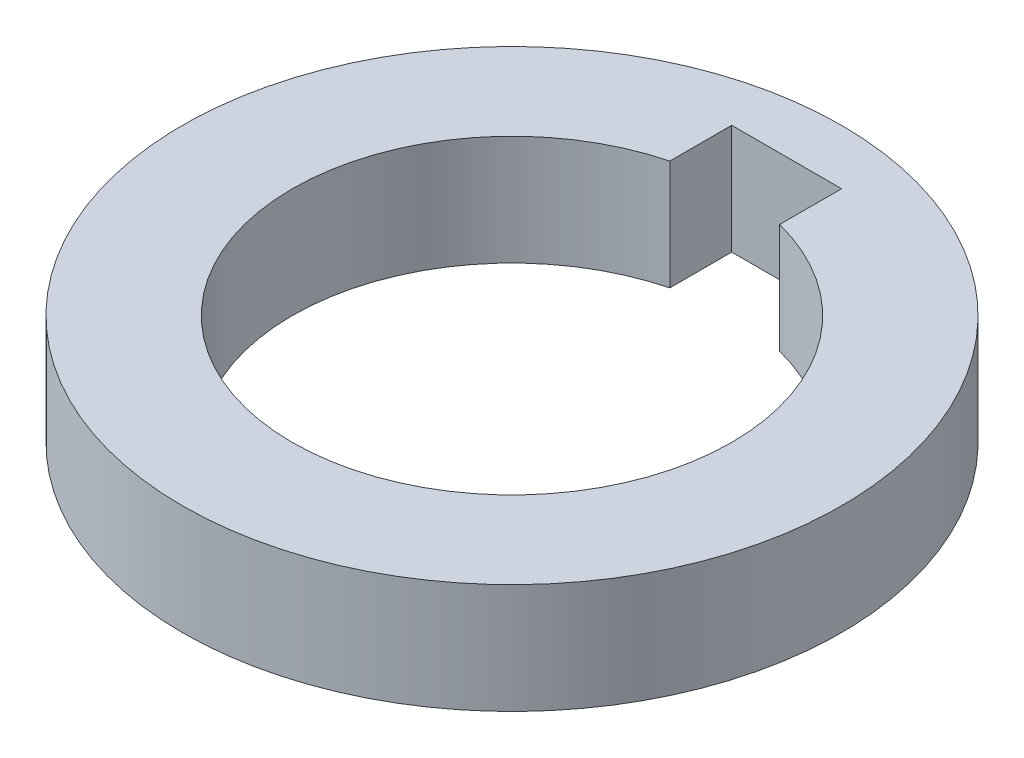
ISO-10303-21;
HEADER;
FILE_DESCRIPTION(('STEP AP214'),'2;1');
FILE_NAME('part.step','',(''),(''),'','','');
FILE_SCHEMA(('AUTOMOTIVE_DESIGN { 1 0 10303 214 1 1 1 1 }'));
ENDSEC;
DATA;
#1=APPLICATION_CONTEXT('core data for automotive mechanical design processes');
#2=APPLICATION_PROTOCOL_DEFINITION('international standard','automotive_design',2000,#1);
#3=PRODUCT_CONTEXT('',#1,'mechanical');
#4=PRODUCT('Part','Part','',(#3));
#5=PRODUCT_RELATED_PRODUCT_CATEGORY('part','',(#4));
#6=PRODUCT_DEFINITION_FORMATION('','',#4);
#7=PRODUCT_DEFINITION_CONTEXT('part definition',#1,'design');
#8=PRODUCT_DEFINITION('design','',#6,#7);
#9=PRODUCT_DEFINITION_SHAPE('','',#8);
#10=(LENGTH_UNIT() NAMED_UNIT(*) SI_UNIT(.MILLI.,.METRE.));
#11=(NAMED_UNIT(*) PLANE_ANGLE_UNIT() SI_UNIT($,.RADIAN.));
#12=(NAMED_UNIT(*) SI_UNIT($,.STERADIAN.) SOLID_ANGLE_UNIT());
#13=UNCERTAINTY_MEASURE_WITH_UNIT(LENGTH_MEASURE(1.E-05),#10,'distance_accuracy_value','');
#14=(GEOMETRIC_REPRESENTATION_CONTEXT(3) GLOBAL_UNCERTAINTY_ASSIGNED_CONTEXT((#13)) GLOBAL_UNIT_ASSIGNED_CONTEXT((#10,
#11,#12)) REPRESENTATION_CONTEXT('',''));
#15=CARTESIAN_POINT('',(0.,0.,0.));
#16=DIRECTION('',(0.,0.,1.));
#17=DIRECTION('',(1.,0.,0.));
#18=AXIS2_PLACEMENT_3D('',#15,#16,#17);
#19=CARTESIAN_POINT('',(0.,3.175,0.));
#20=DIRECTION('',(0.,-1.,0.));
#21=DIRECTION('',(0.,0.,-1.));
#22=AXIS2_PLACEMENT_3D('',#19,#20,#21);
#23=CYLINDRICAL_SURFACE('',#22,6.35);
#24=CARTESIAN_POINT('',(0.,0.,0.));
#25=DIRECTION('',(0.,1.,0.));
#26=DIRECTION('',(0.,0.,1.));
#27=AXIS2_PLACEMENT_3D('',#24,#25,#26);
#28=CIRCLE('',#27,6.35);
#29=CARTESIAN_POINT('',(-1.5875,0.,-6.14836106210427));
#30=VERTEX_POINT('',#29);
#31=CARTESIAN_POINT('',(1.5875,0.,-6.14836106210427));
#32=VERTEX_POINT('',#31);
#33=EDGE_CURVE('E102',#30,#32,#28,.T.);
#34=ORIENTED_EDGE('',*,*,#33,.F.);
#35=DIRECTION('',(0.,-1.,0.));
#36=VECTOR('',#35,1.);
#37=CARTESIAN_POINT('',(-1.5875,3.175,-6.14836106210427));
#38=LINE('',#37,#36);
#39=CARTESIAN_POINT('',(-1.5875,3.175,-6.14836106210427));
#40=VERTEX_POINT('',#39);
#41=EDGE_CURVE('E11',#40,#30,#38,.T.);
#42=ORIENTED_EDGE('',*,*,#41,.F.);
#43=CARTESIAN_POINT('',(0.,3.175,0.));
#44=DIRECTION('',(0.,1.,0.));
#45=DIRECTION('',(0.,0.,1.));
#46=AXIS2_PLACEMENT_3D('',#43,#44,#45);
#47=CIRCLE('',#46,6.35);
#48=CARTESIAN_POINT('',(1.5875,3.175,-6.14836106210427));
#49=VERTEX_POINT('',#48);
#50=EDGE_CURVE('E93',#40,#49,#47,.T.);
#51=ORIENTED_EDGE('',*,*,#50,.T.);
#52=DIRECTION('',(0.,-1.,0.));
#53=VECTOR('',#52,1.);
#54=CARTESIAN_POINT('',(1.5875,3.175,-6.14836106210427));
#55=LINE('',#54,#53);
#56=EDGE_CURVE('E73',#49,#32,#55,.T.);
#57=ORIENTED_EDGE('',*,*,#56,.T.);
#58=EDGE_LOOP('',(#34,#42,#51,#57));
#59=FACE_BOUND('',#58,.T.);
#60=ADVANCED_FACE('F35',(#59),#23,.F.);
#61=CARTESIAN_POINT('',(-1.5875,3.175,0.));
#62=DIRECTION('',(1.,0.,0.));
#63=DIRECTION('',(0.,0.,-1.));
#64=AXIS2_PLACEMENT_3D('',#61,#62,#63);
#65=PLANE('',#64);
#66=DIRECTION('',(0.,0.,1.));
#67=VECTOR('',#66,1.);
#68=CARTESIAN_POINT('',(-1.5875,0.,0.));
#69=LINE('',#68,#67);
#70=CARTESIAN_POINT('',(-1.5875,0.,-7.9375));
#71=VERTEX_POINT('',#70);
#72=EDGE_CURVE('E86',#71,#30,#69,.T.);
#73=ORIENTED_EDGE('',*,*,#72,.F.);
#74=DIRECTION('',(0.,-1.,0.));
#75=VECTOR('',#74,1.);
#76=CARTESIAN_POINT('',(-1.5875,3.175,-7.9375));
#77=LINE('',#76,#75);
#78=CARTESIAN_POINT('',(-1.5875,3.175,-7.9375));
#79=VERTEX_POINT('',#78);
#80=EDGE_CURVE('E43',#79,#71,#77,.T.);
#81=ORIENTED_EDGE('',*,*,#80,.F.);
#82=DIRECTION('',(0.,0.,1.));
#83=VECTOR('',#82,1.);
#84=CARTESIAN_POINT('',(-1.5875,3.175,0.));
#85=LINE('',#84,#83);
#86=EDGE_CURVE('E84',#79,#40,#85,.T.);
#87=ORIENTED_EDGE('',*,*,#86,.T.);
#88=ORIENTED_EDGE('',*,*,#41,.T.);
#89=EDGE_LOOP('',(#73,#81,#87,#88));
#90=FACE_BOUND('',#89,.T.);
#91=ADVANCED_FACE('F82',(#90),#65,.T.);
#92=CARTESIAN_POINT('',(0.,3.175,-7.9375));
#93=DIRECTION('',(0.,0.,-1.));
#94=DIRECTION('',(-1.,0.,0.));
#95=AXIS2_PLACEMENT_3D('',#92,#93,#94);
#96=PLANE('',#95);
#97=DIRECTION('',(1.,0.,0.));
#98=VECTOR('',#97,1.);
#99=CARTESIAN_POINT('',(0.,0.,-7.9375));
#100=LINE('',#99,#98);
#101=CARTESIAN_POINT('',(1.5875,0.,-7.9375));
#102=VERTEX_POINT('',#101);
#103=EDGE_CURVE('E66',#71,#102,#100,.T.);
#104=ORIENTED_EDGE('',*,*,#103,.T.);
#105=DIRECTION('',(0.,-1.,0.));
#106=VECTOR('',#105,1.);
#107=CARTESIAN_POINT('',(1.5875,3.175,-7.9375));
#108=LINE('',#107,#106);
#109=CARTESIAN_POINT('',(1.5875,3.175,-7.9375));
#110=VERTEX_POINT('',#109);
#111=EDGE_CURVE('E87',#110,#102,#108,.T.);
#112=ORIENTED_EDGE('',*,*,#111,.F.);
#113=DIRECTION('',(1.,0.,0.));
#114=VECTOR('',#113,1.);
#115=CARTESIAN_POINT('',(0.,3.175,-7.9375));
#116=LINE('',#115,#114);
#117=EDGE_CURVE('E88',#79,#110,#116,.T.);
#118=ORIENTED_EDGE('',*,*,#117,.F.);
#119=ORIENTED_EDGE('',*,*,#80,.T.);
#120=EDGE_LOOP('',(#104,#112,#118,#119));
#121=FACE_BOUND('',#120,.T.);
#122=ADVANCED_FACE('F89',(#121),#96,.F.);
#123=CARTESIAN_POINT('',(1.5875,3.175,0.));
#124=DIRECTION('',(1.,0.,0.));
#125=DIRECTION('',(0.,0.,-1.));
#126=AXIS2_PLACEMENT_3D('',#123,#124,#125);
#127=PLANE('',#126);
#128=DIRECTION('',(0.,0.,1.));
#129=VECTOR('',#128,1.);
#130=CARTESIAN_POINT('',(1.5875,0.,0.));
#131=LINE('',#130,#129);
#132=EDGE_CURVE('E107',#102,#32,#131,.T.);
#133=ORIENTED_EDGE('',*,*,#132,.T.);
#134=ORIENTED_EDGE('',*,*,#56,.F.);
#135=DIRECTION('',(0.,0.,1.));
#136=VECTOR('',#135,1.);
#137=CARTESIAN_POINT('',(1.5875,3.175,0.));
#138=LINE('',#137,#136);
#139=EDGE_CURVE('E51',#110,#49,#138,.T.);
#140=ORIENTED_EDGE('',*,*,#139,.F.);
#141=ORIENTED_EDGE('',*,*,#111,.T.);
#142=EDGE_LOOP('',(#133,#134,#140,#141));
#143=FACE_BOUND('',#142,.T.);
#144=ADVANCED_FACE('F114',(#143),#127,.F.);
#145=CARTESIAN_POINT('',(0.,3.175,0.));
#146=DIRECTION('',(0.,-1.,0.));
#147=DIRECTION('',(0.,0.,-1.));
#148=AXIS2_PLACEMENT_3D('',#145,#146,#147);
#149=CYLINDRICAL_SURFACE('',#148,9.525);
#150=CARTESIAN_POINT('',(0.,3.175,0.));
#151=DIRECTION('',(0.,1.,0.));
#152=DIRECTION('',(0.,0.,1.));
#153=AXIS2_PLACEMENT_3D('',#150,#151,#152);
#154=CIRCLE('',#153,9.525);
#155=CARTESIAN_POINT('',(0.,3.175,9.525));
#156=VERTEX_POINT('',#155);
#157=EDGE_CURVE('E99',#156,#156,#154,.T.);
#158=ORIENTED_EDGE('',*,*,#157,.F.);
#159=EDGE_LOOP('',(#158));
#160=FACE_BOUND('',#159,.T.);
#161=CARTESIAN_POINT('',(0.,0.,0.));
#162=DIRECTION('',(0.,1.,0.));
#163=DIRECTION('',(0.,0.,1.));
#164=AXIS2_PLACEMENT_3D('',#161,#162,#163);
#165=CIRCLE('',#164,9.525);
#166=CARTESIAN_POINT('',(0.,0.,9.525));
#167=VERTEX_POINT('',#166);
#168=EDGE_CURVE('E95',#167,#167,#165,.T.);
#169=ORIENTED_EDGE('',*,*,#168,.T.);
#170=EDGE_LOOP('',(#169));
#171=FACE_BOUND('',#170,.T.);
#172=ADVANCED_FACE('F129',(#160,#171),#149,.T.);
#173=CARTESIAN_POINT('',(0.,3.175,0.));
#174=DIRECTION('',(0.,1.,0.));
#175=DIRECTION('',(0.,0.,1.));
#176=AXIS2_PLACEMENT_3D('',#173,#174,#175);
#177=PLANE('',#176);
#178=ORIENTED_EDGE('',*,*,#50,.F.);
#179=ORIENTED_EDGE('',*,*,#86,.F.);
#180=ORIENTED_EDGE('',*,*,#117,.T.);
#181=ORIENTED_EDGE('',*,*,#139,.T.);
#182=EDGE_LOOP('',(#178,#179,#180,#181));
#183=FACE_BOUND('',#182,.T.);
#184=ORIENTED_EDGE('',*,*,#157,.T.);
#185=EDGE_LOOP('',(#184));
#186=FACE_BOUND('',#185,.T.);
#187=ADVANCED_FACE('F91',(#183,#186),#177,.T.);
#188=CARTESIAN_POINT('',(0.,0.,0.));
#189=DIRECTION('',(0.,1.,0.));
#190=DIRECTION('',(0.,0.,1.));
#191=AXIS2_PLACEMENT_3D('',#188,#189,#190);
#192=PLANE('',#191);
#193=ORIENTED_EDGE('',*,*,#33,.T.);
#194=ORIENTED_EDGE('',*,*,#132,.F.);
#195=ORIENTED_EDGE('',*,*,#103,.F.);
#196=ORIENTED_EDGE('',*,*,#72,.T.);
#197=EDGE_LOOP('',(#193,#194,#195,#196));
#198=FACE_BOUND('',#197,.T.);
#199=ORIENTED_EDGE('',*,*,#168,.F.);
#200=EDGE_LOOP('',(#199));
#201=FACE_BOUND('',#200,.T.);
#202=ADVANCED_FACE('F116',(#198,#201),#192,.F.);
#203=CLOSED_SHELL('',(#60,#91,#122,#144,#172,#187,#202));
#204=MANIFOLD_SOLID_BREP('B2',#203);
#205=ADVANCED_BREP_SHAPE_REPRESENTATION('',(#18,#204),#14);
#206=SHAPE_DEFINITION_REPRESENTATION(#9,#205);
ENDSEC;
END-ISO-10303-21;
